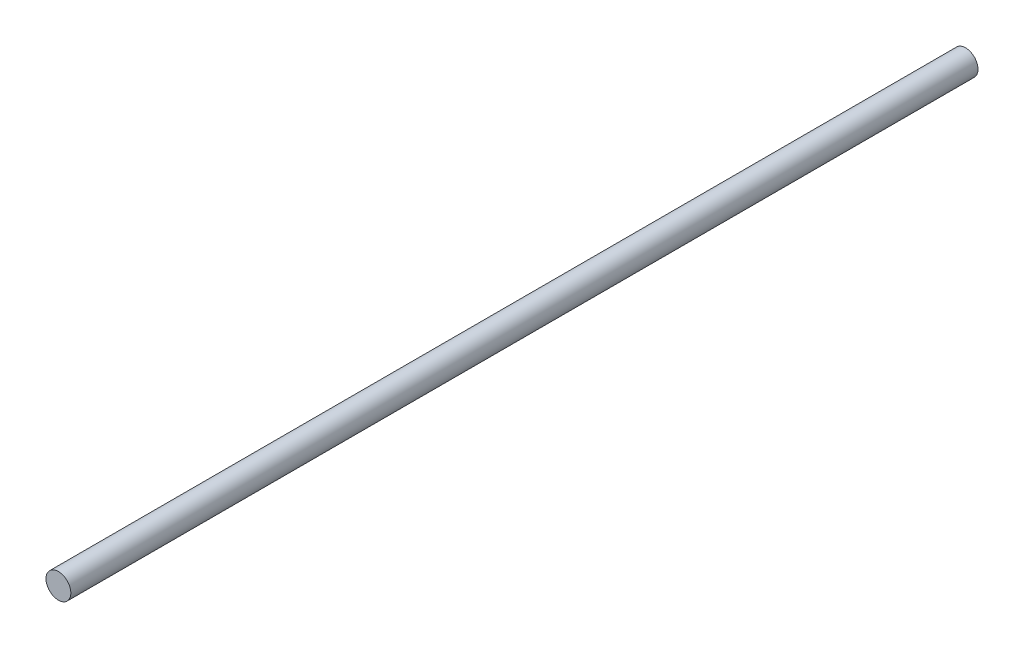
ISO-10303-21;
HEADER;
FILE_DESCRIPTION(('STEP AP214'),'2;1');
FILE_NAME('part.step','',(''),(''),'','','');
FILE_SCHEMA(('AUTOMOTIVE_DESIGN { 1 0 10303 214 1 1 1 1 }'));
ENDSEC;
DATA;
#1=APPLICATION_CONTEXT('core data for automotive mechanical design processes');
#2=APPLICATION_PROTOCOL_DEFINITION('international standard','automotive_design',2000,#1);
#3=PRODUCT_CONTEXT('',#1,'mechanical');
#4=PRODUCT('Part','Part','',(#3));
#5=PRODUCT_RELATED_PRODUCT_CATEGORY('part','',(#4));
#6=PRODUCT_DEFINITION_FORMATION('','',#4);
#7=PRODUCT_DEFINITION_CONTEXT('part definition',#1,'design');
#8=PRODUCT_DEFINITION('design','',#6,#7);
#9=PRODUCT_DEFINITION_SHAPE('','',#8);
#10=(LENGTH_UNIT() NAMED_UNIT(*) SI_UNIT(.MILLI.,.METRE.));
#11=(NAMED_UNIT(*) PLANE_ANGLE_UNIT() SI_UNIT($,.RADIAN.));
#12=(NAMED_UNIT(*) SI_UNIT($,.STERADIAN.) SOLID_ANGLE_UNIT());
#13=UNCERTAINTY_MEASURE_WITH_UNIT(LENGTH_MEASURE(1.E-05),#10,'distance_accuracy_value','');
#14=(GEOMETRIC_REPRESENTATION_CONTEXT(3) GLOBAL_UNCERTAINTY_ASSIGNED_CONTEXT((#13)) GLOBAL_UNIT_ASSIGNED_CONTEXT((#10,
#11,#12)) REPRESENTATION_CONTEXT('',''));
#15=CARTESIAN_POINT('',(0.,0.,0.));
#16=DIRECTION('',(0.,0.,1.));
#17=DIRECTION('',(1.,0.,0.));
#18=AXIS2_PLACEMENT_3D('',#15,#16,#17);
#19=CARTESIAN_POINT('',(0.,0.,463.55));
#20=DIRECTION('',(0.,0.,-1.));
#21=DIRECTION('',(-1.,0.,0.));
#22=AXIS2_PLACEMENT_3D('',#19,#20,#21);
#23=CYLINDRICAL_SURFACE('',#22,6.35);
#24=CARTESIAN_POINT('',(0.,0.,463.55));
#25=DIRECTION('',(0.,0.,1.));
#26=DIRECTION('',(1.,0.,0.));
#27=AXIS2_PLACEMENT_3D('',#24,#25,#26);
#28=CIRCLE('',#27,6.35);
#29=CARTESIAN_POINT('',(6.35,0.,463.55));
#30=VERTEX_POINT('',#29);
#31=EDGE_CURVE('E10',#30,#30,#28,.T.);
#32=ORIENTED_EDGE('',*,*,#31,.F.);
#33=EDGE_LOOP('',(#32));
#34=FACE_BOUND('',#33,.T.);
#35=CARTESIAN_POINT('',(0.,0.,0.));
#36=DIRECTION('',(0.,0.,1.));
#37=DIRECTION('',(1.,0.,0.));
#38=AXIS2_PLACEMENT_3D('',#35,#36,#37);
#39=CIRCLE('',#38,6.35);
#40=CARTESIAN_POINT('',(6.35,0.,0.));
#41=VERTEX_POINT('',#40);
#42=EDGE_CURVE('E34',#41,#41,#39,.T.);
#43=ORIENTED_EDGE('',*,*,#42,.T.);
#44=EDGE_LOOP('',(#43));
#45=FACE_BOUND('',#44,.T.);
#46=ADVANCED_FACE('F31',(#34,#45),#23,.T.);
#47=CARTESIAN_POINT('',(0.,0.,463.55));
#48=DIRECTION('',(0.,0.,1.));
#49=DIRECTION('',(1.,0.,0.));
#50=AXIS2_PLACEMENT_3D('',#47,#48,#49);
#51=PLANE('',#50);
#52=ORIENTED_EDGE('',*,*,#31,.T.);
#53=EDGE_LOOP('',(#52));
#54=FACE_BOUND('',#53,.T.);
#55=ADVANCED_FACE('F46',(#54),#51,.T.);
#56=CARTESIAN_POINT('',(0.,0.,0.));
#57=DIRECTION('',(0.,0.,1.));
#58=DIRECTION('',(1.,0.,0.));
#59=AXIS2_PLACEMENT_3D('',#56,#57,#58);
#60=PLANE('',#59);
#61=ORIENTED_EDGE('',*,*,#42,.F.);
#62=EDGE_LOOP('',(#61));
#63=FACE_BOUND('',#62,.T.);
#64=ADVANCED_FACE('F44',(#63),#60,.F.);
#65=CLOSED_SHELL('',(#46,#55,#64));
#66=MANIFOLD_SOLID_BREP('B2',#65);
#67=ADVANCED_BREP_SHAPE_REPRESENTATION('',(#18,#66),#14);
#68=SHAPE_DEFINITION_REPRESENTATION(#9,#67);
ENDSEC;
END-ISO-10303-21;
